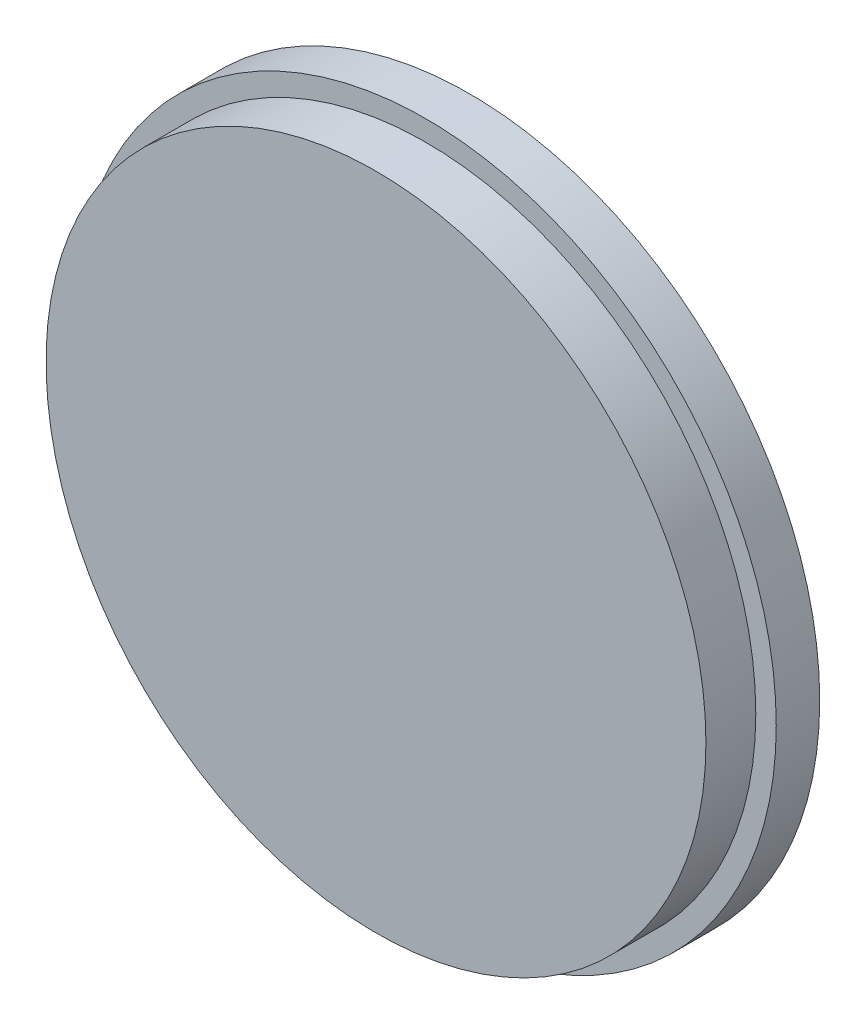
ISO-10303-21;
HEADER;
FILE_DESCRIPTION(('STEP AP214'),'2;1');
FILE_NAME('part.step','',(''),(''),'','','');
FILE_SCHEMA(('AUTOMOTIVE_DESIGN { 1 0 10303 214 1 1 1 1 }'));
ENDSEC;
DATA;
#1=APPLICATION_CONTEXT('core data for automotive mechanical design processes');
#2=APPLICATION_PROTOCOL_DEFINITION('international standard','automotive_design',2000,#1);
#3=PRODUCT_CONTEXT('',#1,'mechanical');
#4=PRODUCT('Part','Part','',(#3));
#5=PRODUCT_RELATED_PRODUCT_CATEGORY('part','',(#4));
#6=PRODUCT_DEFINITION_FORMATION('','',#4);
#7=PRODUCT_DEFINITION_CONTEXT('part definition',#1,'design');
#8=PRODUCT_DEFINITION('design','',#6,#7);
#9=PRODUCT_DEFINITION_SHAPE('','',#8);
#10=(LENGTH_UNIT() NAMED_UNIT(*) SI_UNIT(.MILLI.,.METRE.));
#11=(NAMED_UNIT(*) PLANE_ANGLE_UNIT() SI_UNIT($,.RADIAN.));
#12=(NAMED_UNIT(*) SI_UNIT($,.STERADIAN.) SOLID_ANGLE_UNIT());
#13=UNCERTAINTY_MEASURE_WITH_UNIT(LENGTH_MEASURE(1.E-05),#10,'distance_accuracy_value','');
#14=(GEOMETRIC_REPRESENTATION_CONTEXT(3) GLOBAL_UNCERTAINTY_ASSIGNED_CONTEXT((#13)) GLOBAL_UNIT_ASSIGNED_CONTEXT((#10,
#11,#12)) REPRESENTATION_CONTEXT('',''));
#15=CARTESIAN_POINT('',(0.,0.,0.));
#16=DIRECTION('',(0.,0.,1.));
#17=DIRECTION('',(1.,0.,0.));
#18=AXIS2_PLACEMENT_3D('',#15,#16,#17);
#19=CARTESIAN_POINT('',(0.,0.,-3.4));
#20=DIRECTION('',(0.,0.,1.));
#21=DIRECTION('',(1.,0.,0.));
#22=AXIS2_PLACEMENT_3D('',#19,#20,#21);
#23=CYLINDRICAL_SURFACE('',#22,27.4);
#24=CARTESIAN_POINT('',(0.,0.,-3.4));
#25=DIRECTION('',(0.,0.,1.));
#26=DIRECTION('',(1.,0.,0.));
#27=AXIS2_PLACEMENT_3D('',#24,#25,#26);
#28=CIRCLE('',#27,27.4);
#29=CARTESIAN_POINT('',(27.4,0.,-3.4));
#30=VERTEX_POINT('',#29);
#31=EDGE_CURVE('E40',#30,#30,#28,.T.);
#32=ORIENTED_EDGE('',*,*,#31,.T.);
#33=EDGE_LOOP('',(#32));
#34=FACE_BOUND('',#33,.T.);
#35=CARTESIAN_POINT('',(0.,0.,0.));
#36=DIRECTION('',(0.,0.,1.));
#37=DIRECTION('',(1.,0.,0.));
#38=AXIS2_PLACEMENT_3D('',#35,#36,#37);
#39=CIRCLE('',#38,27.4);
#40=CARTESIAN_POINT('',(27.4,0.,0.));
#41=VERTEX_POINT('',#40);
#42=EDGE_CURVE('E36',#41,#41,#39,.T.);
#43=ORIENTED_EDGE('',*,*,#42,.F.);
#44=EDGE_LOOP('',(#43));
#45=FACE_BOUND('',#44,.T.);
#46=ADVANCED_FACE('F33',(#34,#45),#23,.T.);
#47=CARTESIAN_POINT('',(0.,0.,-3.4));
#48=DIRECTION('',(0.,0.,1.));
#49=DIRECTION('',(1.,0.,0.));
#50=AXIS2_PLACEMENT_3D('',#47,#48,#49);
#51=PLANE('',#50);
#52=ORIENTED_EDGE('',*,*,#31,.F.);
#53=EDGE_LOOP('',(#52));
#54=FACE_BOUND('',#53,.T.);
#55=ADVANCED_FACE('F56',(#54),#51,.F.);
#56=CARTESIAN_POINT('',(0.,0.,0.));
#57=DIRECTION('',(0.,0.,1.));
#58=DIRECTION('',(1.,0.,0.));
#59=AXIS2_PLACEMENT_3D('',#56,#57,#58);
#60=PLANE('',#59);
#61=CARTESIAN_POINT('',(0.,0.,0.));
#62=DIRECTION('',(0.,0.,1.));
#63=DIRECTION('',(1.,0.,0.));
#64=AXIS2_PLACEMENT_3D('',#61,#62,#63);
#65=CIRCLE('',#64,25.8);
#66=CARTESIAN_POINT('',(25.8,0.,0.));
#67=VERTEX_POINT('',#66);
#68=EDGE_CURVE('E10',#67,#67,#65,.T.);
#69=ORIENTED_EDGE('',*,*,#68,.F.);
#70=EDGE_LOOP('',(#69));
#71=FACE_BOUND('',#70,.T.);
#72=ORIENTED_EDGE('',*,*,#42,.T.);
#73=EDGE_LOOP('',(#72));
#74=FACE_BOUND('',#73,.T.);
#75=ADVANCED_FACE('F53',(#71,#74),#60,.T.);
#76=CARTESIAN_POINT('',(0.,0.,3.9));
#77=DIRECTION('',(0.,0.,-1.));
#78=DIRECTION('',(-1.,0.,0.));
#79=AXIS2_PLACEMENT_3D('',#76,#77,#78);
#80=CYLINDRICAL_SURFACE('',#79,25.8);
#81=CARTESIAN_POINT('',(0.,0.,3.9));
#82=DIRECTION('',(0.,0.,1.));
#83=DIRECTION('',(1.,0.,0.));
#84=AXIS2_PLACEMENT_3D('',#81,#82,#83);
#85=CIRCLE('',#84,25.8);
#86=CARTESIAN_POINT('',(25.8,0.,3.9));
#87=VERTEX_POINT('',#86);
#88=EDGE_CURVE('E46',#87,#87,#85,.T.);
#89=ORIENTED_EDGE('',*,*,#88,.F.);
#90=EDGE_LOOP('',(#89));
#91=FACE_BOUND('',#90,.T.);
#92=ORIENTED_EDGE('',*,*,#68,.T.);
#93=EDGE_LOOP('',(#92));
#94=FACE_BOUND('',#93,.T.);
#95=ADVANCED_FACE('F67',(#91,#94),#80,.T.);
#96=CARTESIAN_POINT('',(0.,0.,3.9));
#97=DIRECTION('',(0.,0.,1.));
#98=DIRECTION('',(1.,0.,0.));
#99=AXIS2_PLACEMENT_3D('',#96,#97,#98);
#100=PLANE('',#99);
#101=ORIENTED_EDGE('',*,*,#88,.T.);
#102=EDGE_LOOP('',(#101));
#103=FACE_BOUND('',#102,.T.);
#104=ADVANCED_FACE('F72',(#103),#100,.T.);
#105=CLOSED_SHELL('',(#46,#55,#75,#95,#104));
#106=MANIFOLD_SOLID_BREP('B2',#105);
#107=ADVANCED_BREP_SHAPE_REPRESENTATION('',(#18,#106),#14);
#108=SHAPE_DEFINITION_REPRESENTATION(#9,#107);
ENDSEC;
END-ISO-10303-21;
